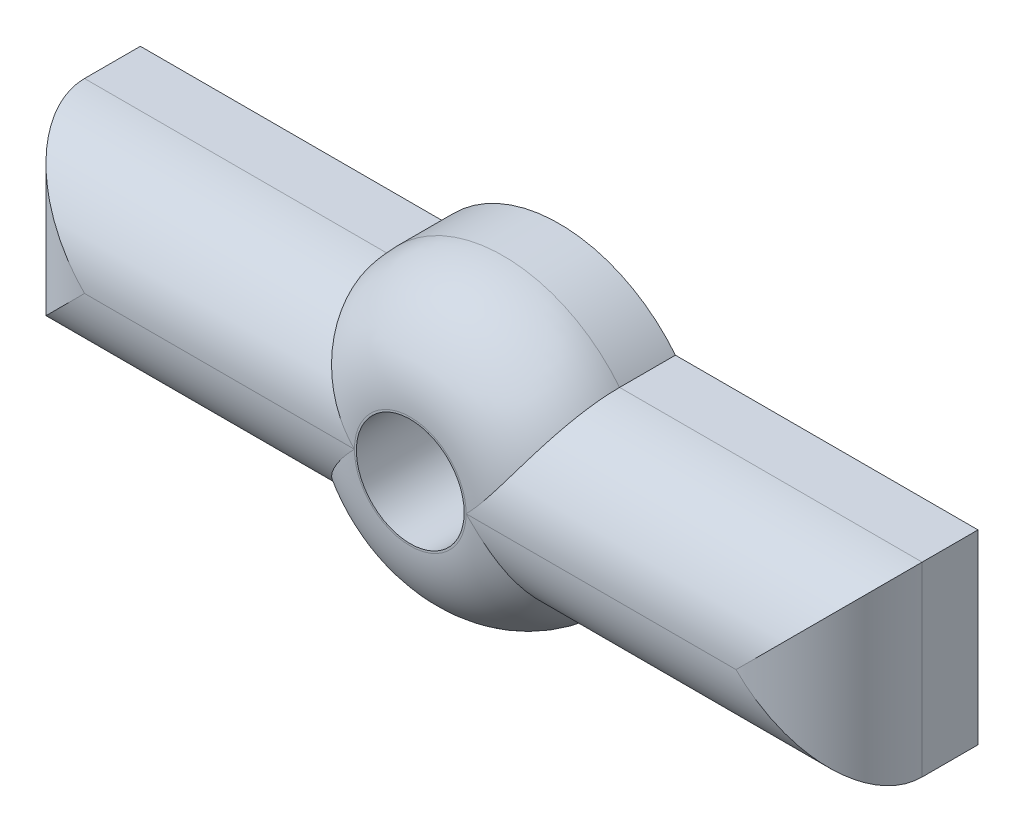
ISO-10303-21;
HEADER;
FILE_DESCRIPTION(('STEP AP214'),'2;1');
FILE_NAME('part.step','',(''),(''),'','','');
FILE_SCHEMA(('AUTOMOTIVE_DESIGN { 1 0 10303 214 1 1 1 1 }'));
ENDSEC;
DATA;
#1=APPLICATION_CONTEXT('core data for automotive mechanical design processes');
#2=APPLICATION_PROTOCOL_DEFINITION('international standard','automotive_design',2000,#1);
#3=PRODUCT_CONTEXT('',#1,'mechanical');
#4=PRODUCT('Part','Part','',(#3));
#5=PRODUCT_RELATED_PRODUCT_CATEGORY('part','',(#4));
#6=PRODUCT_DEFINITION_FORMATION('','',#4);
#7=PRODUCT_DEFINITION_CONTEXT('part definition',#1,'design');
#8=PRODUCT_DEFINITION('design','',#6,#7);
#9=PRODUCT_DEFINITION_SHAPE('','',#8);
#10=(LENGTH_UNIT() NAMED_UNIT(*) SI_UNIT(.MILLI.,.METRE.));
#11=(NAMED_UNIT(*) PLANE_ANGLE_UNIT() SI_UNIT($,.RADIAN.));
#12=(NAMED_UNIT(*) SI_UNIT($,.STERADIAN.) SOLID_ANGLE_UNIT());
#13=UNCERTAINTY_MEASURE_WITH_UNIT(LENGTH_MEASURE(1.E-05),#10,'distance_accuracy_value','');
#14=(GEOMETRIC_REPRESENTATION_CONTEXT(3) GLOBAL_UNCERTAINTY_ASSIGNED_CONTEXT((#13)) GLOBAL_UNIT_ASSIGNED_CONTEXT((#10,
#11,#12)) REPRESENTATION_CONTEXT('',''));
#15=CARTESIAN_POINT('',(0.,0.,0.));
#16=DIRECTION('',(0.,0.,1.));
#17=DIRECTION('',(1.,0.,0.));
#18=AXIS2_PLACEMENT_3D('',#15,#16,#17);
#19=CARTESIAN_POINT('',(-22.5,5.,8.));
#20=DIRECTION('',(1.,0.,0.));
#21=DIRECTION('',(0.,0.,-1.));
#22=AXIS2_PLACEMENT_3D('',#19,#20,#21);
#23=PLANE('',#22);
#24=DIRECTION('',(0.,0.,-1.));
#25=VECTOR('',#24,1.);
#26=CARTESIAN_POINT('',(-22.5,-5.,8.));
#27=LINE('',#26,#25);
#28=CARTESIAN_POINT('',(-22.5,-5.,3.));
#29=VERTEX_POINT('',#28);
#30=CARTESIAN_POINT('',(-22.5,-5.,0.));
#31=VERTEX_POINT('',#30);
#32=EDGE_CURVE('E74',#29,#31,#27,.T.);
#33=ORIENTED_EDGE('',*,*,#32,.F.);
#34=DIRECTION('',(0.,-1.,0.));
#35=VECTOR('',#34,1.);
#36=CARTESIAN_POINT('',(-22.5,5.,3.));
#37=LINE('',#36,#35);
#38=CARTESIAN_POINT('',(-22.5,5.,3.));
#39=VERTEX_POINT('',#38);
#40=EDGE_CURVE('E11',#29,#39,#37,.F.);
#41=ORIENTED_EDGE('',*,*,#40,.T.);
#42=DIRECTION('',(0.,0.,-1.));
#43=VECTOR('',#42,1.);
#44=CARTESIAN_POINT('',(-22.5,5.,8.));
#45=LINE('',#44,#43);
#46=CARTESIAN_POINT('',(-22.5,5.,0.));
#47=VERTEX_POINT('',#46);
#48=EDGE_CURVE('E281',#39,#47,#45,.T.);
#49=ORIENTED_EDGE('',*,*,#48,.T.);
#50=DIRECTION('',(0.,-1.,0.));
#51=VECTOR('',#50,1.);
#52=CARTESIAN_POINT('',(-22.5,5.,0.));
#53=LINE('',#52,#51);
#54=EDGE_CURVE('E143',#47,#31,#53,.T.);
#55=ORIENTED_EDGE('',*,*,#54,.T.);
#56=EDGE_LOOP('',(#33,#41,#49,#55));
#57=FACE_BOUND('',#56,.T.);
#58=ADVANCED_FACE('F33',(#57),#23,.F.);
#59=CARTESIAN_POINT('',(-22.5,-5.,8.));
#60=DIRECTION('',(0.,1.,0.));
#61=DIRECTION('',(0.,0.,1.));
#62=AXIS2_PLACEMENT_3D('',#59,#60,#61);
#63=PLANE('',#62);
#64=DIRECTION('',(0.,0.,-1.));
#65=VECTOR('',#64,1.);
#66=CARTESIAN_POINT('',(-6.2449979983984,-5.,8.));
#67=LINE('',#66,#65);
#68=CARTESIAN_POINT('',(-6.2449979983984,-5.,3.));
#69=VERTEX_POINT('',#68);
#70=CARTESIAN_POINT('',(-6.2449979983984,-5.,0.));
#71=VERTEX_POINT('',#70);
#72=EDGE_CURVE('E289',#69,#71,#67,.T.);
#73=ORIENTED_EDGE('',*,*,#72,.F.);
#74=DIRECTION('',(1.,0.,0.));
#75=VECTOR('',#74,1.);
#76=CARTESIAN_POINT('',(-22.5,-5.,3.));
#77=LINE('',#76,#75);
#78=EDGE_CURVE('E43',#69,#29,#77,.F.);
#79=ORIENTED_EDGE('',*,*,#78,.T.);
#80=ORIENTED_EDGE('',*,*,#32,.T.);
#81=DIRECTION('',(1.,0.,0.));
#82=VECTOR('',#81,1.);
#83=CARTESIAN_POINT('',(-22.5,-5.,0.));
#84=LINE('',#83,#82);
#85=EDGE_CURVE('E264',#31,#71,#84,.T.);
#86=ORIENTED_EDGE('',*,*,#85,.T.);
#87=EDGE_LOOP('',(#73,#79,#80,#86));
#88=FACE_BOUND('',#87,.T.);
#89=ADVANCED_FACE('F215',(#88),#63,.F.);
#90=CARTESIAN_POINT('',(0.,0.,8.));
#91=DIRECTION('',(0.,0.,-1.));
#92=DIRECTION('',(-1.,0.,0.));
#93=AXIS2_PLACEMENT_3D('',#90,#91,#92);
#94=CYLINDRICAL_SURFACE('',#93,8.);
#95=DIRECTION('',(0.,0.,-1.));
#96=VECTOR('',#95,1.);
#97=CARTESIAN_POINT('',(6.2449979983984,-5.,8.));
#98=LINE('',#97,#96);
#99=CARTESIAN_POINT('',(6.2449979983984,-5.,3.));
#100=VERTEX_POINT('',#99);
#101=CARTESIAN_POINT('',(6.2449979983984,-5.,0.));
#102=VERTEX_POINT('',#101);
#103=EDGE_CURVE('E139',#100,#102,#98,.T.);
#104=ORIENTED_EDGE('',*,*,#103,.F.);
#105=CARTESIAN_POINT('',(0.,0.,3.));
#106=DIRECTION('',(0.,0.,1.));
#107=DIRECTION('',(1.,0.,0.));
#108=AXIS2_PLACEMENT_3D('',#105,#106,#107);
#109=CIRCLE('',#108,8.);
#110=EDGE_CURVE('E300',#100,#69,#109,.F.);
#111=ORIENTED_EDGE('',*,*,#110,.T.);
#112=ORIENTED_EDGE('',*,*,#72,.T.);
#113=CARTESIAN_POINT('',(0.,0.,0.));
#114=DIRECTION('',(0.,0.,1.));
#115=DIRECTION('',(1.,0.,0.));
#116=AXIS2_PLACEMENT_3D('',#113,#114,#115);
#117=CIRCLE('',#116,8.);
#118=EDGE_CURVE('E266',#71,#102,#117,.T.);
#119=ORIENTED_EDGE('',*,*,#118,.T.);
#120=EDGE_LOOP('',(#104,#111,#112,#119));
#121=FACE_BOUND('',#120,.T.);
#122=ADVANCED_FACE('F220',(#121),#94,.T.);
#123=CARTESIAN_POINT('',(6.2449979983984,-5.,8.));
#124=DIRECTION('',(0.,1.,0.));
#125=DIRECTION('',(0.,0.,1.));
#126=AXIS2_PLACEMENT_3D('',#123,#124,#125);
#127=PLANE('',#126);
#128=DIRECTION('',(0.,0.,-1.));
#129=VECTOR('',#128,1.);
#130=CARTESIAN_POINT('',(22.5,-5.,8.));
#131=LINE('',#130,#129);
#132=CARTESIAN_POINT('',(22.5,-5.,3.));
#133=VERTEX_POINT('',#132);
#134=CARTESIAN_POINT('',(22.5,-5.,0.));
#135=VERTEX_POINT('',#134);
#136=EDGE_CURVE('E125',#133,#135,#131,.T.);
#137=ORIENTED_EDGE('',*,*,#136,.F.);
#138=DIRECTION('',(1.,0.,0.));
#139=VECTOR('',#138,1.);
#140=CARTESIAN_POINT('',(6.2449979983984,-5.,3.));
#141=LINE('',#140,#139);
#142=EDGE_CURVE('E130',#133,#100,#141,.F.);
#143=ORIENTED_EDGE('',*,*,#142,.T.);
#144=ORIENTED_EDGE('',*,*,#103,.T.);
#145=DIRECTION('',(1.,0.,0.));
#146=VECTOR('',#145,1.);
#147=CARTESIAN_POINT('',(6.2449979983984,-5.,0.));
#148=LINE('',#147,#146);
#149=EDGE_CURVE('E137',#102,#135,#148,.T.);
#150=ORIENTED_EDGE('',*,*,#149,.T.);
#151=EDGE_LOOP('',(#137,#143,#144,#150));
#152=FACE_BOUND('',#151,.T.);
#153=ADVANCED_FACE('F134',(#152),#127,.F.);
#154=CARTESIAN_POINT('',(22.5,5.,8.));
#155=DIRECTION('',(-1.,0.,0.));
#156=DIRECTION('',(0.,0.,1.));
#157=AXIS2_PLACEMENT_3D('',#154,#155,#156);
#158=PLANE('',#157);
#159=DIRECTION('',(0.,0.,-1.));
#160=VECTOR('',#159,1.);
#161=CARTESIAN_POINT('',(22.5,5.,8.));
#162=LINE('',#161,#160);
#163=CARTESIAN_POINT('',(22.5,5.,3.));
#164=VERTEX_POINT('',#163);
#165=CARTESIAN_POINT('',(22.5,5.,0.));
#166=VERTEX_POINT('',#165);
#167=EDGE_CURVE('E127',#164,#166,#162,.T.);
#168=ORIENTED_EDGE('',*,*,#167,.F.);
#169=DIRECTION('',(0.,1.,0.));
#170=VECTOR('',#169,1.);
#171=CARTESIAN_POINT('',(22.5,-5.,3.));
#172=LINE('',#171,#170);
#173=EDGE_CURVE('E121',#164,#133,#172,.F.);
#174=ORIENTED_EDGE('',*,*,#173,.T.);
#175=ORIENTED_EDGE('',*,*,#136,.T.);
#176=DIRECTION('',(0.,1.,0.));
#177=VECTOR('',#176,1.);
#178=CARTESIAN_POINT('',(22.5,5.,0.));
#179=LINE('',#178,#177);
#180=EDGE_CURVE('E270',#135,#166,#179,.T.);
#181=ORIENTED_EDGE('',*,*,#180,.T.);
#182=EDGE_LOOP('',(#168,#174,#175,#181));
#183=FACE_BOUND('',#182,.T.);
#184=ADVANCED_FACE('F123',(#183),#158,.F.);
#185=CARTESIAN_POINT('',(6.2449979983984,5.,8.));
#186=DIRECTION('',(0.,-1.,0.));
#187=DIRECTION('',(0.,0.,-1.));
#188=AXIS2_PLACEMENT_3D('',#185,#186,#187);
#189=PLANE('',#188);
#190=DIRECTION('',(0.,0.,-1.));
#191=VECTOR('',#190,1.);
#192=CARTESIAN_POINT('',(6.2449979983984,5.,8.));
#193=LINE('',#192,#191);
#194=CARTESIAN_POINT('',(6.2449979983984,5.,3.));
#195=VERTEX_POINT('',#194);
#196=CARTESIAN_POINT('',(6.2449979983984,5.,0.));
#197=VERTEX_POINT('',#196);
#198=EDGE_CURVE('E285',#195,#197,#193,.T.);
#199=ORIENTED_EDGE('',*,*,#198,.F.);
#200=DIRECTION('',(-1.,0.,0.));
#201=VECTOR('',#200,1.);
#202=CARTESIAN_POINT('',(22.5,5.,3.));
#203=LINE('',#202,#201);
#204=EDGE_CURVE('E131',#195,#164,#203,.F.);
#205=ORIENTED_EDGE('',*,*,#204,.T.);
#206=ORIENTED_EDGE('',*,*,#167,.T.);
#207=DIRECTION('',(-1.,0.,0.));
#208=VECTOR('',#207,1.);
#209=CARTESIAN_POINT('',(6.2449979983984,5.,0.));
#210=LINE('',#209,#208);
#211=EDGE_CURVE('E272',#166,#197,#210,.T.);
#212=ORIENTED_EDGE('',*,*,#211,.T.);
#213=EDGE_LOOP('',(#199,#205,#206,#212));
#214=FACE_BOUND('',#213,.T.);
#215=ADVANCED_FACE('F230',(#214),#189,.F.);
#216=CARTESIAN_POINT('',(0.,0.,8.));
#217=DIRECTION('',(0.,0.,-1.));
#218=DIRECTION('',(-1.,0.,0.));
#219=AXIS2_PLACEMENT_3D('',#216,#217,#218);
#220=CYLINDRICAL_SURFACE('',#219,8.);
#221=DIRECTION('',(0.,0.,-1.));
#222=VECTOR('',#221,1.);
#223=CARTESIAN_POINT('',(-6.2449979983984,5.,8.));
#224=LINE('',#223,#222);
#225=CARTESIAN_POINT('',(-6.2449979983984,5.,3.));
#226=VERTEX_POINT('',#225);
#227=CARTESIAN_POINT('',(-6.2449979983984,5.,0.));
#228=VERTEX_POINT('',#227);
#229=EDGE_CURVE('E283',#226,#228,#224,.T.);
#230=ORIENTED_EDGE('',*,*,#229,.F.);
#231=CARTESIAN_POINT('',(0.,0.,3.));
#232=DIRECTION('',(0.,0.,1.));
#233=DIRECTION('',(1.,0.,0.));
#234=AXIS2_PLACEMENT_3D('',#231,#232,#233);
#235=CIRCLE('',#234,8.);
#236=EDGE_CURVE('E297',#226,#195,#235,.F.);
#237=ORIENTED_EDGE('',*,*,#236,.T.);
#238=ORIENTED_EDGE('',*,*,#198,.T.);
#239=CARTESIAN_POINT('',(0.,0.,0.));
#240=DIRECTION('',(0.,0.,1.));
#241=DIRECTION('',(1.,0.,0.));
#242=AXIS2_PLACEMENT_3D('',#239,#240,#241);
#243=CIRCLE('',#242,8.);
#244=EDGE_CURVE('E275',#197,#228,#243,.T.);
#245=ORIENTED_EDGE('',*,*,#244,.T.);
#246=EDGE_LOOP('',(#230,#237,#238,#245));
#247=FACE_BOUND('',#246,.T.);
#248=ADVANCED_FACE('F233',(#247),#220,.T.);
#249=CARTESIAN_POINT('',(-22.5,5.,8.));
#250=DIRECTION('',(0.,-1.,0.));
#251=DIRECTION('',(0.,0.,-1.));
#252=AXIS2_PLACEMENT_3D('',#249,#250,#251);
#253=PLANE('',#252);
#254=ORIENTED_EDGE('',*,*,#48,.F.);
#255=DIRECTION('',(-1.,0.,0.));
#256=VECTOR('',#255,1.);
#257=CARTESIAN_POINT('',(-6.2449979983984,5.,3.));
#258=LINE('',#257,#256);
#259=EDGE_CURVE('E148',#39,#226,#258,.F.);
#260=ORIENTED_EDGE('',*,*,#259,.T.);
#261=ORIENTED_EDGE('',*,*,#229,.T.);
#262=DIRECTION('',(-1.,0.,0.));
#263=VECTOR('',#262,1.);
#264=CARTESIAN_POINT('',(-22.5,5.,0.));
#265=LINE('',#264,#263);
#266=EDGE_CURVE('E278',#228,#47,#265,.T.);
#267=ORIENTED_EDGE('',*,*,#266,.T.);
#268=EDGE_LOOP('',(#254,#260,#261,#267));
#269=FACE_BOUND('',#268,.T.);
#270=ADVANCED_FACE('F237',(#269),#253,.F.);
#271=CARTESIAN_POINT('',(0.,0.,8.));
#272=DIRECTION('',(0.,0.,1.));
#273=DIRECTION('',(1.,0.,0.));
#274=AXIS2_PLACEMENT_3D('',#271,#272,#273);
#275=PLANE('',#274);
#276=CARTESIAN_POINT('',(0.,0.,8.));
#277=DIRECTION('',(0.,0.,1.));
#278=DIRECTION('',(1.,0.,0.));
#279=AXIS2_PLACEMENT_3D('',#276,#277,#278);
#280=CIRCLE('',#279,2.8956);
#281=CARTESIAN_POINT('',(2.8956,0.,8.));
#282=VERTEX_POINT('',#281);
#283=EDGE_CURVE('E258',#282,#282,#280,.T.);
#284=ORIENTED_EDGE('',*,*,#283,.F.);
#285=EDGE_LOOP('',(#284));
#286=FACE_BOUND('',#285,.T.);
#287=CARTESIAN_POINT('',(0.,0.,8.));
#288=DIRECTION('',(0.,0.,1.));
#289=DIRECTION('',(1.,0.,0.));
#290=AXIS2_PLACEMENT_3D('',#287,#288,#289);
#291=CIRCLE('',#290,3.);
#292=CARTESIAN_POINT('',(-3.,0.,8.));
#293=VERTEX_POINT('',#292);
#294=CARTESIAN_POINT('',(3.,0.,8.));
#295=VERTEX_POINT('',#294);
#296=EDGE_CURVE('E292',#293,#295,#291,.T.);
#297=ORIENTED_EDGE('',*,*,#296,.T.);
#298=CARTESIAN_POINT('',(0.,0.,8.));
#299=DIRECTION('',(0.,0.,1.));
#300=DIRECTION('',(1.,0.,0.));
#301=AXIS2_PLACEMENT_3D('',#298,#299,#300);
#302=CIRCLE('',#301,3.);
#303=EDGE_CURVE('E294',#295,#293,#302,.T.);
#304=ORIENTED_EDGE('',*,*,#303,.T.);
#305=EDGE_LOOP('',(#297,#304));
#306=FACE_BOUND('',#305,.T.);
#307=ADVANCED_FACE('F241',(#286,#306),#275,.T.);
#308=CARTESIAN_POINT('',(0.,0.,0.));
#309=DIRECTION('',(0.,0.,1.));
#310=DIRECTION('',(1.,0.,0.));
#311=AXIS2_PLACEMENT_3D('',#308,#309,#310);
#312=PLANE('',#311);
#313=CARTESIAN_POINT('',(0.,0.,0.));
#314=DIRECTION('',(0.,0.,1.));
#315=DIRECTION('',(1.,0.,0.));
#316=AXIS2_PLACEMENT_3D('',#313,#314,#315);
#317=CIRCLE('',#316,2.8956);
#318=CARTESIAN_POINT('',(2.8956,0.,0.));
#319=VERTEX_POINT('',#318);
#320=EDGE_CURVE('E163',#319,#319,#317,.T.);
#321=ORIENTED_EDGE('',*,*,#320,.T.);
#322=EDGE_LOOP('',(#321));
#323=FACE_BOUND('',#322,.T.);
#324=ORIENTED_EDGE('',*,*,#54,.F.);
#325=ORIENTED_EDGE('',*,*,#266,.F.);
#326=ORIENTED_EDGE('',*,*,#244,.F.);
#327=ORIENTED_EDGE('',*,*,#211,.F.);
#328=ORIENTED_EDGE('',*,*,#180,.F.);
#329=ORIENTED_EDGE('',*,*,#149,.F.);
#330=ORIENTED_EDGE('',*,*,#118,.F.);
#331=ORIENTED_EDGE('',*,*,#85,.F.);
#332=EDGE_LOOP('',(#324,#325,#326,#327,#328,#329,#330,#331));
#333=FACE_BOUND('',#332,.T.);
#334=ADVANCED_FACE('F192',(#323,#333),#312,.F.);
#335=CARTESIAN_POINT('',(0.,0.,3.));
#336=DIRECTION('',(0.,0.,1.));
#337=DIRECTION('',(1.,0.,0.));
#338=AXIS2_PLACEMENT_3D('',#335,#336,#337);
#339=DEGENERATE_TOROIDAL_SURFACE('',#338,3.,5.,.T.);
#340=CARTESIAN_POINT('',(-6.2449979983984,-5.,3.));
#341=CARTESIAN_POINT('',(-6.24500198034874,-5.00002076837858,3.1296063159917));
#342=CARTESIAN_POINT('',(-6.24257742136541,-4.99496157758865,3.25920713261458));
#343=CARTESIAN_POINT('',(-6.23290088489058,-4.9748350010865,3.51742418375614));
#344=CARTESIAN_POINT('',(-6.22564981732577,-4.95976950183373,3.64604059923878));
#345=CARTESIAN_POINT('',(-6.20637579834484,-4.91983557136824,3.90102230676167));
#346=CARTESIAN_POINT('',(-6.19436570249394,-4.89499355070103,4.0273927128534));
#347=CARTESIAN_POINT('',(-6.16562818097474,-4.8357938488026,4.27733646550291));
#348=CARTESIAN_POINT('',(-6.14890069054499,-4.80143603693656,4.40090977363633));
#349=CARTESIAN_POINT('',(-6.11080842323117,-4.72360292588494,4.64435421465612));
#350=CARTESIAN_POINT('',(-6.08944560870868,-4.68013148521093,4.76422688974737));
#351=CARTESIAN_POINT('',(-6.04215788087151,-4.58451878374281,4.9995817393348));
#352=CARTESIAN_POINT('',(-6.01623127690076,-4.53237431041913,5.1150622674136));
#353=CARTESIAN_POINT('',(-5.95992521141675,-4.4199860422982,5.3408600967211));
#354=CARTESIAN_POINT('',(-5.9295462462386,-4.35974315034885,5.45117797165986));
#355=CARTESIAN_POINT('',(-5.86443131717017,-4.23174908011554,5.66607336639463));
#356=CARTESIAN_POINT('',(-5.82969370799807,-4.16399506769759,5.77064869697652));
#357=CARTESIAN_POINT('',(-5.75494182932772,-4.01965321971621,5.97634294893879));
#358=CARTESIAN_POINT('',(-5.71480603693218,-3.94286962870379,6.0772802597783));
#359=CARTESIAN_POINT('',(-5.63017160438211,-3.78284017806871,6.27200379313065));
#360=CARTESIAN_POINT('',(-5.58567138285365,-3.69959197840096,6.36578740158216));
#361=CARTESIAN_POINT('',(-5.49245505482306,-3.52748180236384,6.54575400165471));
#362=CARTESIAN_POINT('',(-5.44373980771026,-3.43862097133048,6.63193853542783));
#363=CARTESIAN_POINT('',(-5.34218813912837,-3.25606583481972,6.79646429228072));
#364=CARTESIAN_POINT('',(-5.28935023962493,-3.16236979996152,6.8748026791963));
#365=CARTESIAN_POINT('',(-5.17523397809214,-2.96325546053043,7.02942473479001));
#366=CARTESIAN_POINT('',(-5.11361860291687,-2.85750224007016,7.10502864102177));
#367=CARTESIAN_POINT('',(-4.98583118347652,-2.64240492554536,7.24667903886374));
#368=CARTESIAN_POINT('',(-4.91965868181723,-2.53306047161017,7.31272456903998));
#369=CARTESIAN_POINT('',(-4.78280270554574,-2.31175260830879,7.43529156199167));
#370=CARTESIAN_POINT('',(-4.71211583521807,-2.19978726858114,7.49180573611316));
#371=CARTESIAN_POINT('',(-4.56635729659481,-1.97438470287309,7.59534389138601));
#372=CARTESIAN_POINT('',(-4.49128654261313,-1.86094778762002,7.64236984237484));
#373=CARTESIAN_POINT('',(-4.32795406596592,-1.62062946391171,7.73200001845574));
#374=CARTESIAN_POINT('',(-4.23916434873669,-1.49369010386529,7.77348841471774));
#375=CARTESIAN_POINT('',(-4.05614802942415,-1.24066051697304,7.84541623615528));
#376=CARTESIAN_POINT('',(-3.96192252709492,-1.11457012409097,7.87585788725724));
#377=CARTESIAN_POINT('',(-3.76803109639104,-0.864778459976033,7.92629387712217));
#378=CARTESIAN_POINT('',(-3.66837238272086,-0.74107430217551,7.94630171477605));
#379=CARTESIAN_POINT('',(-3.4633312328058,-0.497358735950781,7.97671615363301));
#380=CARTESIAN_POINT('',(-3.35795089859715,-0.377345996401849,7.98712625596108));
#381=CARTESIAN_POINT('',(-3.17129264743521,-0.175163043144979,7.99765213415327));
#382=CARTESIAN_POINT('',(-3.09146653605871,-0.0917544269985003,7.99982625071859));
#383=CARTESIAN_POINT('',(-3.00666387251003,-0.00666943227667556,7.99999667093796));
#384=CARTESIAN_POINT('',(-3.00333331392384,-0.00333331861255585,8.00000000464552));
#385=CARTESIAN_POINT('',(-3.,0.,8.));
#386=B_SPLINE_CURVE_WITH_KNOTS('',3,(#340,#341,#342,#343,#344,#345,#346,#347,#348,#349,#350,
#351,#352,#353,#354,#355,#356,#357,#358,#359,#360,#361,#362,#363,#364,#365,#366,#367,#368,#369,
#370,#371,#372,#373,#374,#375,#376,#377,#378,#379,#380,#381,#382,#383,#384,#385),.UNSPECIFIED.,
.F.,.F.,(4,2,2,2,2,2,2,2,2,2,2,2,2,2,2,2,2,2,2,2,2,2,4),(0.,0.388689192402583,0.777305127184899,
1.1648783727709,1.55245693930866,1.93987174372726,2.3274303691803,2.71494582364298,
3.10260799830463,3.5012427004564,3.90002237825507,4.29872094075594,4.69756310548944,
5.12869395720015,5.55986814432552,5.99137057105153,6.42278332174159,6.90339429701637,
7.38390837501822,7.86379922922639,8.34351495635059,8.68975762984293,8.70389977390814),.UNSPECIFIED.);
#387=EDGE_CURVE('E197',#69,#293,#386,.T.);
#388=ORIENTED_EDGE('',*,*,#387,.F.);
#389=ORIENTED_EDGE('',*,*,#110,.F.);
#390=CARTESIAN_POINT('',(6.2449979983984,-5.,3.));
#391=CARTESIAN_POINT('',(6.24500198034874,-5.00002076837858,3.1296063159917));
#392=CARTESIAN_POINT('',(6.24257742136541,-4.99496157758865,3.25920713261458));
#393=CARTESIAN_POINT('',(6.23290088489058,-4.9748350010865,3.51742418375614));
#394=CARTESIAN_POINT('',(6.22564981732577,-4.95976950183373,3.64604059923878));
#395=CARTESIAN_POINT('',(6.20637579834484,-4.91983557136824,3.90102230676167));
#396=CARTESIAN_POINT('',(6.19436570249394,-4.89499355070103,4.0273927128534));
#397=CARTESIAN_POINT('',(6.16562818097474,-4.8357938488026,4.27733646550291));
#398=CARTESIAN_POINT('',(6.14890069054499,-4.80143603693656,4.40090977363633));
#399=CARTESIAN_POINT('',(6.11080842323117,-4.72360292588494,4.64435421465612));
#400=CARTESIAN_POINT('',(6.08944560870868,-4.68013148521093,4.76422688974737));
#401=CARTESIAN_POINT('',(6.04215788087151,-4.58451878374281,4.9995817393348));
#402=CARTESIAN_POINT('',(6.01623127690076,-4.53237431041913,5.1150622674136));
#403=CARTESIAN_POINT('',(5.95992521141675,-4.4199860422982,5.3408600967211));
#404=CARTESIAN_POINT('',(5.9295462462386,-4.35974315034885,5.45117797165986));
#405=CARTESIAN_POINT('',(5.86443131717017,-4.23174908011554,5.66607336639463));
#406=CARTESIAN_POINT('',(5.82969370799807,-4.16399506769759,5.77064869697652));
#407=CARTESIAN_POINT('',(5.75494182932772,-4.01965321971621,5.97634294893879));
#408=CARTESIAN_POINT('',(5.71480603693218,-3.94286962870379,6.0772802597783));
#409=CARTESIAN_POINT('',(5.63017160438211,-3.78284017806871,6.27200379313065));
#410=CARTESIAN_POINT('',(5.58567138285365,-3.69959197840096,6.36578740158216));
#411=CARTESIAN_POINT('',(5.49245505482306,-3.52748180236384,6.54575400165471));
#412=CARTESIAN_POINT('',(5.44373980771026,-3.43862097133048,6.63193853542783));
#413=CARTESIAN_POINT('',(5.34218813912837,-3.25606583481972,6.79646429228072));
#414=CARTESIAN_POINT('',(5.28935023962493,-3.16236979996152,6.8748026791963));
#415=CARTESIAN_POINT('',(5.17523397809214,-2.96325546053043,7.02942473479001));
#416=CARTESIAN_POINT('',(5.11361860291687,-2.85750224007016,7.10502864102177));
#417=CARTESIAN_POINT('',(4.98583118347652,-2.64240492554536,7.24667903886374));
#418=CARTESIAN_POINT('',(4.91965868181723,-2.53306047161017,7.31272456903998));
#419=CARTESIAN_POINT('',(4.78280270554574,-2.31175260830879,7.43529156199167));
#420=CARTESIAN_POINT('',(4.71211583521807,-2.19978726858114,7.49180573611316));
#421=CARTESIAN_POINT('',(4.56635729659481,-1.97438470287309,7.59534389138601));
#422=CARTESIAN_POINT('',(4.49128654261313,-1.86094778762002,7.64236984237484));
#423=CARTESIAN_POINT('',(4.32795406596592,-1.62062946391171,7.73200001845574));
#424=CARTESIAN_POINT('',(4.23916434873669,-1.49369010386529,7.77348841471774));
#425=CARTESIAN_POINT('',(4.05614802942415,-1.24066051697304,7.84541623615528));
#426=CARTESIAN_POINT('',(3.96192252709492,-1.11457012409097,7.87585788725724));
#427=CARTESIAN_POINT('',(3.76803109639104,-0.864778459976033,7.92629387712217));
#428=CARTESIAN_POINT('',(3.66837238272086,-0.74107430217551,7.94630171477605));
#429=CARTESIAN_POINT('',(3.4633312328058,-0.497358735950781,7.97671615363301));
#430=CARTESIAN_POINT('',(3.35795089859715,-0.377345996401849,7.98712625596108));
#431=CARTESIAN_POINT('',(3.17129264743521,-0.175163043144979,7.99765213415327));
#432=CARTESIAN_POINT('',(3.09146653605871,-0.0917544269985003,7.99982625071859));
#433=CARTESIAN_POINT('',(3.00666387251003,-0.00666943227667556,7.99999667093796));
#434=CARTESIAN_POINT('',(3.00333331392384,-0.00333331861255585,8.00000000464552));
#435=CARTESIAN_POINT('',(3.,0.,8.));
#436=B_SPLINE_CURVE_WITH_KNOTS('',3,(#390,#391,#392,#393,#394,#395,#396,#397,#398,#399,#400,
#401,#402,#403,#404,#405,#406,#407,#408,#409,#410,#411,#412,#413,#414,#415,#416,#417,#418,#419,
#420,#421,#422,#423,#424,#425,#426,#427,#428,#429,#430,#431,#432,#433,#434,#435),.UNSPECIFIED.,
.F.,.F.,(4,2,2,2,2,2,2,2,2,2,2,2,2,2,2,2,2,2,2,2,2,2,4),(0.,0.388689192402583,0.777305127184899,
1.1648783727709,1.55245693930866,1.93987174372726,2.3274303691803,2.71494582364298,
3.10260799830463,3.5012427004564,3.90002237825507,4.29872094075594,4.69756310548944,
5.12869395720015,5.55986814432552,5.99137057105153,6.42278332174159,6.90339429701637,
7.38390837501822,7.86379922922639,8.34351495635059,8.68975762984293,8.70389977390814),.UNSPECIFIED.);
#437=EDGE_CURVE('E144',#295,#100,#436,.F.);
#438=ORIENTED_EDGE('',*,*,#437,.F.);
#439=ORIENTED_EDGE('',*,*,#296,.F.);
#440=EDGE_LOOP('',(#388,#389,#438,#439));
#441=FACE_BOUND('',#440,.T.);
#442=ADVANCED_FACE('F188',(#441),#339,.T.);
#443=CARTESIAN_POINT('',(17.5,0.,3.));
#444=DIRECTION('',(0.,-1.,0.));
#445=DIRECTION('',(0.,0.,-1.));
#446=AXIS2_PLACEMENT_3D('',#443,#444,#445);
#447=CYLINDRICAL_SURFACE('',#446,5.);
#448=CARTESIAN_POINT('',(17.5,0.,3.));
#449=DIRECTION('',(-0.707106781186547,-0.707106781186547,0.));
#450=DIRECTION('',(-0.707106781186547,0.707106781186547,0.));
#451=AXIS2_PLACEMENT_3D('',#448,#449,#450);
#452=ELLIPSE('',#451,7.07106781186547,5.);
#453=CARTESIAN_POINT('',(17.5,0.,8.));
#454=VERTEX_POINT('',#453);
#455=EDGE_CURVE('E37',#133,#454,#452,.T.);
#456=ORIENTED_EDGE('',*,*,#455,.F.);
#457=ORIENTED_EDGE('',*,*,#173,.F.);
#458=CARTESIAN_POINT('',(17.5,0.,3.));
#459=DIRECTION('',(0.707106781186547,-0.707106781186547,0.));
#460=DIRECTION('',(-0.707106781186547,-0.707106781186547,0.));
#461=AXIS2_PLACEMENT_3D('',#458,#459,#460);
#462=ELLIPSE('',#461,7.07106781186547,5.);
#463=EDGE_CURVE('E141',#454,#164,#462,.F.);
#464=ORIENTED_EDGE('',*,*,#463,.F.);
#465=EDGE_LOOP('',(#456,#457,#464));
#466=FACE_BOUND('',#465,.T.);
#467=ADVANCED_FACE('F35',(#466),#447,.T.);
#468=CARTESIAN_POINT('',(0.,0.,3.));
#469=DIRECTION('',(-1.,0.,0.));
#470=DIRECTION('',(0.,0.,1.));
#471=AXIS2_PLACEMENT_3D('',#468,#469,#470);
#472=CYLINDRICAL_SURFACE('',#471,5.);
#473=ORIENTED_EDGE('',*,*,#142,.F.);
#474=ORIENTED_EDGE('',*,*,#455,.T.);
#475=DIRECTION('',(1.,0.,0.));
#476=VECTOR('',#475,1.);
#477=CARTESIAN_POINT('',(22.5,0.,8.));
#478=LINE('',#477,#476);
#479=EDGE_CURVE('E315',#295,#454,#478,.T.);
#480=ORIENTED_EDGE('',*,*,#479,.F.);
#481=ORIENTED_EDGE('',*,*,#437,.T.);
#482=EDGE_LOOP('',(#473,#474,#480,#481));
#483=FACE_BOUND('',#482,.T.);
#484=ADVANCED_FACE('F146',(#483),#472,.T.);
#485=CARTESIAN_POINT('',(0.,0.,3.));
#486=DIRECTION('',(-1.,0.,0.));
#487=DIRECTION('',(0.,0.,1.));
#488=AXIS2_PLACEMENT_3D('',#485,#486,#487);
#489=CYLINDRICAL_SURFACE('',#488,5.);
#490=CARTESIAN_POINT('',(-17.5,0.,3.));
#491=DIRECTION('',(-0.707106781186547,0.707106781186547,0.));
#492=DIRECTION('',(0.707106781186547,0.707106781186547,0.));
#493=AXIS2_PLACEMENT_3D('',#490,#491,#492);
#494=ELLIPSE('',#493,7.07106781186547,5.);
#495=CARTESIAN_POINT('',(-17.5,0.,8.));
#496=VERTEX_POINT('',#495);
#497=EDGE_CURVE('E62',#29,#496,#494,.T.);
#498=ORIENTED_EDGE('',*,*,#497,.F.);
#499=ORIENTED_EDGE('',*,*,#78,.F.);
#500=ORIENTED_EDGE('',*,*,#387,.T.);
#501=DIRECTION('',(1.,0.,0.));
#502=VECTOR('',#501,1.);
#503=CARTESIAN_POINT('',(-6.2449979983984,0.,8.));
#504=LINE('',#503,#502);
#505=EDGE_CURVE('E312',#496,#293,#504,.T.);
#506=ORIENTED_EDGE('',*,*,#505,.F.);
#507=EDGE_LOOP('',(#498,#499,#500,#506));
#508=FACE_BOUND('',#507,.T.);
#509=ADVANCED_FACE('F187',(#508),#489,.T.);
#510=CARTESIAN_POINT('',(-17.5,0.,3.));
#511=DIRECTION('',(0.,1.,0.));
#512=DIRECTION('',(0.,0.,1.));
#513=AXIS2_PLACEMENT_3D('',#510,#511,#512);
#514=CYLINDRICAL_SURFACE('',#513,5.);
#515=ORIENTED_EDGE('',*,*,#40,.F.);
#516=ORIENTED_EDGE('',*,*,#497,.T.);
#517=CARTESIAN_POINT('',(-17.5,0.,3.));
#518=DIRECTION('',(0.707106781186547,0.707106781186547,0.));
#519=DIRECTION('',(-0.707106781186547,0.707106781186547,0.));
#520=AXIS2_PLACEMENT_3D('',#517,#518,#519);
#521=ELLIPSE('',#520,7.07106781186547,5.);
#522=EDGE_CURVE('E314',#39,#496,#521,.T.);
#523=ORIENTED_EDGE('',*,*,#522,.F.);
#524=EDGE_LOOP('',(#515,#516,#523));
#525=FACE_BOUND('',#524,.T.);
#526=ADVANCED_FACE('F183',(#525),#514,.T.);
#527=CARTESIAN_POINT('',(0.,0.,3.));
#528=DIRECTION('',(1.,0.,0.));
#529=DIRECTION('',(0.,0.,-1.));
#530=AXIS2_PLACEMENT_3D('',#527,#528,#529);
#531=CYLINDRICAL_SURFACE('',#530,5.);
#532=ORIENTED_EDGE('',*,*,#463,.T.);
#533=ORIENTED_EDGE('',*,*,#204,.F.);
#534=CARTESIAN_POINT('',(6.2449979983984,5.,3.));
#535=CARTESIAN_POINT('',(6.24500198034874,5.00002076837858,3.1296063159917));
#536=CARTESIAN_POINT('',(6.24257742136541,4.99496157758864,3.25920713261458));
#537=CARTESIAN_POINT('',(6.23290088489058,4.9748350010865,3.51742418375614));
#538=CARTESIAN_POINT('',(6.22564981732577,4.95976950183373,3.64604059923878));
#539=CARTESIAN_POINT('',(6.20637579834484,4.91983557136824,3.90102230676167));
#540=CARTESIAN_POINT('',(6.19436570249394,4.89499355070103,4.0273927128534));
#541=CARTESIAN_POINT('',(6.16562818097474,4.8357938488026,4.2773364655029));
#542=CARTESIAN_POINT('',(6.14890069054499,4.80143603693656,4.40090977363633));
#543=CARTESIAN_POINT('',(6.11080842323117,4.72360292588494,4.64435421465612));
#544=CARTESIAN_POINT('',(6.08944560870869,4.68013148521093,4.76422688974737));
#545=CARTESIAN_POINT('',(6.04215788087151,4.58451878374281,4.9995817393348));
#546=CARTESIAN_POINT('',(6.01623127690076,4.53237431041913,5.1150622674136));
#547=CARTESIAN_POINT('',(5.95992521141676,4.4199860422982,5.3408600967211));
#548=CARTESIAN_POINT('',(5.9295462462386,4.35974315034885,5.45117797165986));
#549=CARTESIAN_POINT('',(5.86443131717018,4.23174908011554,5.66607336639462));
#550=CARTESIAN_POINT('',(5.82969370799807,4.16399506769759,5.77064869697652));
#551=CARTESIAN_POINT('',(5.75494182932772,4.01965321971621,5.97634294893879));
#552=CARTESIAN_POINT('',(5.71480603693218,3.94286962870379,6.0772802597783));
#553=CARTESIAN_POINT('',(5.63017160438211,3.78284017806871,6.27200379313065));
#554=CARTESIAN_POINT('',(5.58567138285365,3.69959197840096,6.36578740158216));
#555=CARTESIAN_POINT('',(5.49245505482306,3.52748180236384,6.54575400165471));
#556=CARTESIAN_POINT('',(5.44373980771026,3.43862097133048,6.63193853542782));
#557=CARTESIAN_POINT('',(5.34218813912837,3.25606583481972,6.79646429228072));
#558=CARTESIAN_POINT('',(5.28935023962493,3.16236979996152,6.8748026791963));
#559=CARTESIAN_POINT('',(5.17523397809214,2.96325546053044,7.02942473479001));
#560=CARTESIAN_POINT('',(5.11361860291687,2.85750224007016,7.10502864102177));
#561=CARTESIAN_POINT('',(4.98583118347652,2.64240492554536,7.24667903886374));
#562=CARTESIAN_POINT('',(4.91965868181723,2.53306047161017,7.31272456903998));
#563=CARTESIAN_POINT('',(4.78280270554574,2.31175260830879,7.43529156199167));
#564=CARTESIAN_POINT('',(4.71211583521807,2.19978726858114,7.49180573611316));
#565=CARTESIAN_POINT('',(4.56635729659481,1.9743847028731,7.59534389138601));
#566=CARTESIAN_POINT('',(4.49128654261313,1.86094778762002,7.64236984237483));
#567=CARTESIAN_POINT('',(4.32795406596592,1.62062946391172,7.73200001845574));
#568=CARTESIAN_POINT('',(4.23916434873669,1.4936901038653,7.77348841471774));
#569=CARTESIAN_POINT('',(4.05614802942415,1.24066051697304,7.84541623615528));
#570=CARTESIAN_POINT('',(3.96192252709492,1.11457012409097,7.87585788725724));
#571=CARTESIAN_POINT('',(3.76803109639104,0.864778459976035,7.92629387712217));
#572=CARTESIAN_POINT('',(3.66837238272087,0.74107430217551,7.94630171477605));
#573=CARTESIAN_POINT('',(3.46333123280581,0.497358735950781,7.97671615363301));
#574=CARTESIAN_POINT('',(3.35795089859715,0.377345996401851,7.98712625596108));
#575=CARTESIAN_POINT('',(3.17129264743521,0.175163043144979,7.99765213415327));
#576=CARTESIAN_POINT('',(3.09146653605872,0.0917544269984985,7.99982625071859));
#577=CARTESIAN_POINT('',(3.00666387251003,0.0066694322766755,7.99999667093796));
#578=CARTESIAN_POINT('',(3.00333331392384,0.00333331861255582,8.00000000464552));
#579=CARTESIAN_POINT('',(3.,0.,8.));
#580=B_SPLINE_CURVE_WITH_KNOTS('',3,(#534,#535,#536,#537,#538,#539,#540,#541,#542,#543,#544,
#545,#546,#547,#548,#549,#550,#551,#552,#553,#554,#555,#556,#557,#558,#559,#560,#561,#562,#563,
#564,#565,#566,#567,#568,#569,#570,#571,#572,#573,#574,#575,#576,#577,#578,#579),.UNSPECIFIED.,
.F.,.F.,(4,2,2,2,2,2,2,2,2,2,2,2,2,2,2,2,2,2,2,2,2,2,4),(0.,0.388689192402583,0.777305127184899,
1.1648783727709,1.55245693930866,1.93987174372726,2.3274303691803,2.71494582364298,
3.10260799830463,3.5012427004564,3.90002237825506,4.29872094075594,4.69756310548944,
5.12869395720015,5.55986814432552,5.99137057105153,6.42278332174159,6.90339429701637,
7.38390837501821,7.86379922922639,8.34351495635059,8.68975762984293,8.70389977390814),.UNSPECIFIED.);
#581=EDGE_CURVE('E162',#295,#195,#580,.F.);
#582=ORIENTED_EDGE('',*,*,#581,.F.);
#583=ORIENTED_EDGE('',*,*,#479,.T.);
#584=EDGE_LOOP('',(#532,#533,#582,#583));
#585=FACE_BOUND('',#584,.T.);
#586=ADVANCED_FACE('F178',(#585),#531,.T.);
#587=CARTESIAN_POINT('',(0.,0.,3.));
#588=DIRECTION('',(1.,0.,0.));
#589=DIRECTION('',(0.,0.,-1.));
#590=AXIS2_PLACEMENT_3D('',#587,#588,#589);
#591=CYLINDRICAL_SURFACE('',#590,5.);
#592=ORIENTED_EDGE('',*,*,#522,.T.);
#593=ORIENTED_EDGE('',*,*,#505,.T.);
#594=CARTESIAN_POINT('',(-6.2449979983984,5.,3.));
#595=CARTESIAN_POINT('',(-6.24500198034874,5.00002076837858,3.1296063159917));
#596=CARTESIAN_POINT('',(-6.24257742136541,4.99496157758864,3.25920713261458));
#597=CARTESIAN_POINT('',(-6.23290088489058,4.9748350010865,3.51742418375614));
#598=CARTESIAN_POINT('',(-6.22564981732577,4.95976950183373,3.64604059923878));
#599=CARTESIAN_POINT('',(-6.20637579834484,4.91983557136824,3.90102230676167));
#600=CARTESIAN_POINT('',(-6.19436570249394,4.89499355070103,4.0273927128534));
#601=CARTESIAN_POINT('',(-6.16562818097474,4.8357938488026,4.27733646550291));
#602=CARTESIAN_POINT('',(-6.14890069054499,4.80143603693656,4.40090977363633));
#603=CARTESIAN_POINT('',(-6.11080842323117,4.72360292588494,4.64435421465612));
#604=CARTESIAN_POINT('',(-6.08944560870868,4.68013148521093,4.76422688974737));
#605=CARTESIAN_POINT('',(-6.04215788087151,4.58451878374281,4.9995817393348));
#606=CARTESIAN_POINT('',(-6.01623127690076,4.53237431041913,5.1150622674136));
#607=CARTESIAN_POINT('',(-5.95992521141675,4.4199860422982,5.3408600967211));
#608=CARTESIAN_POINT('',(-5.9295462462386,4.35974315034885,5.45117797165986));
#609=CARTESIAN_POINT('',(-5.86443131717017,4.23174908011554,5.66607336639463));
#610=CARTESIAN_POINT('',(-5.82969370799807,4.16399506769759,5.77064869697652));
#611=CARTESIAN_POINT('',(-5.75494182932772,4.01965321971621,5.97634294893879));
#612=CARTESIAN_POINT('',(-5.71480603693218,3.94286962870379,6.0772802597783));
#613=CARTESIAN_POINT('',(-5.63017160438211,3.78284017806871,6.27200379313065));
#614=CARTESIAN_POINT('',(-5.58567138285365,3.69959197840096,6.36578740158216));
#615=CARTESIAN_POINT('',(-5.49245505482306,3.52748180236384,6.54575400165471));
#616=CARTESIAN_POINT('',(-5.44373980771026,3.43862097133048,6.63193853542783));
#617=CARTESIAN_POINT('',(-5.34218813912837,3.25606583481972,6.79646429228072));
#618=CARTESIAN_POINT('',(-5.28935023962493,3.16236979996152,6.8748026791963));
#619=CARTESIAN_POINT('',(-5.17523397809214,2.96325546053043,7.02942473479001));
#620=CARTESIAN_POINT('',(-5.11361860291687,2.85750224007016,7.10502864102177));
#621=CARTESIAN_POINT('',(-4.98583118347652,2.64240492554536,7.24667903886374));
#622=CARTESIAN_POINT('',(-4.91965868181723,2.53306047161017,7.31272456903998));
#623=CARTESIAN_POINT('',(-4.78280270554574,2.31175260830879,7.43529156199167));
#624=CARTESIAN_POINT('',(-4.71211583521807,2.19978726858114,7.49180573611316));
#625=CARTESIAN_POINT('',(-4.56635729659481,1.97438470287309,7.59534389138601));
#626=CARTESIAN_POINT('',(-4.49128654261313,1.86094778762002,7.64236984237484));
#627=CARTESIAN_POINT('',(-4.32795406596592,1.62062946391171,7.73200001845574));
#628=CARTESIAN_POINT('',(-4.23916434873669,1.49369010386529,7.77348841471774));
#629=CARTESIAN_POINT('',(-4.05614802942415,1.24066051697304,7.84541623615528));
#630=CARTESIAN_POINT('',(-3.96192252709492,1.11457012409097,7.87585788725724));
#631=CARTESIAN_POINT('',(-3.76803109639104,0.864778459976033,7.92629387712217));
#632=CARTESIAN_POINT('',(-3.66837238272086,0.74107430217551,7.94630171477605));
#633=CARTESIAN_POINT('',(-3.4633312328058,0.497358735950781,7.97671615363301));
#634=CARTESIAN_POINT('',(-3.35795089859715,0.377345996401849,7.98712625596108));
#635=CARTESIAN_POINT('',(-3.17129264743521,0.175163043144979,7.99765213415327));
#636=CARTESIAN_POINT('',(-3.09146653605871,0.0917544269985003,7.99982625071859));
#637=CARTESIAN_POINT('',(-3.00666387251003,0.00666943227667556,7.99999667093796));
#638=CARTESIAN_POINT('',(-3.00333331392384,0.00333331861255585,8.00000000464552));
#639=CARTESIAN_POINT('',(-3.,0.,8.));
#640=B_SPLINE_CURVE_WITH_KNOTS('',3,(#594,#595,#596,#597,#598,#599,#600,#601,#602,#603,#604,
#605,#606,#607,#608,#609,#610,#611,#612,#613,#614,#615,#616,#617,#618,#619,#620,#621,#622,#623,
#624,#625,#626,#627,#628,#629,#630,#631,#632,#633,#634,#635,#636,#637,#638,#639),.UNSPECIFIED.,
.F.,.F.,(4,2,2,2,2,2,2,2,2,2,2,2,2,2,2,2,2,2,2,2,2,2,4),(0.,0.388689192402583,0.777305127184899,
1.1648783727709,1.55245693930866,1.93987174372726,2.3274303691803,2.71494582364298,
3.10260799830463,3.5012427004564,3.90002237825507,4.29872094075594,4.69756310548944,
5.12869395720015,5.55986814432552,5.99137057105153,6.42278332174159,6.90339429701637,
7.38390837501822,7.86379922922639,8.34351495635059,8.68975762984293,8.70389977390814),.UNSPECIFIED.);
#641=EDGE_CURVE('E154',#226,#293,#640,.T.);
#642=ORIENTED_EDGE('',*,*,#641,.F.);
#643=ORIENTED_EDGE('',*,*,#259,.F.);
#644=EDGE_LOOP('',(#592,#593,#642,#643));
#645=FACE_BOUND('',#644,.T.);
#646=ADVANCED_FACE('F170',(#645),#591,.T.);
#647=CARTESIAN_POINT('',(0.,0.,3.));
#648=DIRECTION('',(0.,0.,1.));
#649=DIRECTION('',(1.,0.,0.));
#650=AXIS2_PLACEMENT_3D('',#647,#648,#649);
#651=DEGENERATE_TOROIDAL_SURFACE('',#650,3.,5.,.T.);
#652=ORIENTED_EDGE('',*,*,#581,.T.);
#653=ORIENTED_EDGE('',*,*,#236,.F.);
#654=ORIENTED_EDGE('',*,*,#641,.T.);
#655=ORIENTED_EDGE('',*,*,#303,.F.);
#656=EDGE_LOOP('',(#652,#653,#654,#655));
#657=FACE_BOUND('',#656,.T.);
#658=ADVANCED_FACE('F173',(#657),#651,.T.);
#659=CARTESIAN_POINT('',(0.,0.,8.));
#660=DIRECTION('',(0.,0.,1.));
#661=DIRECTION('',(1.,0.,0.));
#662=AXIS2_PLACEMENT_3D('',#659,#660,#661);
#663=CYLINDRICAL_SURFACE('',#662,2.8956);
#664=ORIENTED_EDGE('',*,*,#320,.F.);
#665=EDGE_LOOP('',(#664));
#666=FACE_BOUND('',#665,.T.);
#667=ORIENTED_EDGE('',*,*,#283,.T.);
#668=EDGE_LOOP('',(#667));
#669=FACE_BOUND('',#668,.T.);
#670=ADVANCED_FACE('F176',(#666,#669),#663,.F.);
#671=CLOSED_SHELL('',(#58,#89,#122,#153,#184,#215,#248,#270,#307,#334,#442,#467,#484,#509,#526,
#586,#646,#658,#670));
#672=MANIFOLD_SOLID_BREP('B2',#671);
#673=ADVANCED_BREP_SHAPE_REPRESENTATION('',(#18,#672),#14);
#674=SHAPE_DEFINITION_REPRESENTATION(#9,#673);
ENDSEC;
END-ISO-10303-21;
